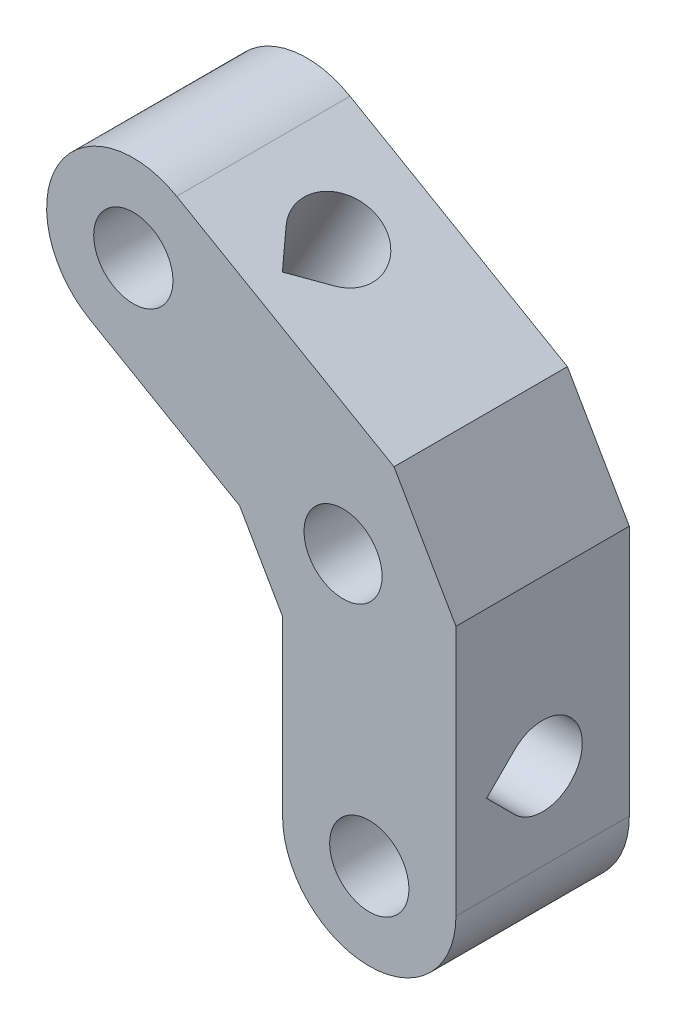
ISO-10303-21;
HEADER;
FILE_DESCRIPTION(('STEP AP214'),'2;1');
FILE_NAME('part.step','',(''),(''),'','','');
FILE_SCHEMA(('AUTOMOTIVE_DESIGN { 1 0 10303 214 1 1 1 1 }'));
ENDSEC;
DATA;
#1=APPLICATION_CONTEXT('core data for automotive mechanical design processes');
#2=APPLICATION_PROTOCOL_DEFINITION('international standard','automotive_design',2000,#1);
#3=PRODUCT_CONTEXT('',#1,'mechanical');
#4=PRODUCT('Part','Part','',(#3));
#5=PRODUCT_RELATED_PRODUCT_CATEGORY('part','',(#4));
#6=PRODUCT_DEFINITION_FORMATION('','',#4);
#7=PRODUCT_DEFINITION_CONTEXT('part definition',#1,'design');
#8=PRODUCT_DEFINITION('design','',#6,#7);
#9=PRODUCT_DEFINITION_SHAPE('','',#8);
#10=(LENGTH_UNIT() NAMED_UNIT(*) SI_UNIT(.MILLI.,.METRE.));
#11=(NAMED_UNIT(*) PLANE_ANGLE_UNIT() SI_UNIT($,.RADIAN.));
#12=(NAMED_UNIT(*) SI_UNIT($,.STERADIAN.) SOLID_ANGLE_UNIT());
#13=UNCERTAINTY_MEASURE_WITH_UNIT(LENGTH_MEASURE(1.E-05),#10,'distance_accuracy_value','');
#14=(GEOMETRIC_REPRESENTATION_CONTEXT(3) GLOBAL_UNCERTAINTY_ASSIGNED_CONTEXT((#13)) GLOBAL_UNIT_ASSIGNED_CONTEXT((#10,
#11,#12)) REPRESENTATION_CONTEXT('',''));
#15=CARTESIAN_POINT('',(0.,0.,0.));
#16=DIRECTION('',(0.,0.,1.));
#17=DIRECTION('',(1.,0.,0.));
#18=AXIS2_PLACEMENT_3D('',#15,#16,#17);
#19=CARTESIAN_POINT('',(1.76659838198365E-13,2.35810055605255E-13,0.));
#20=DIRECTION('',(0.,0.,1.));
#21=DIRECTION('',(1.,0.,0.));
#22=AXIS2_PLACEMENT_3D('',#19,#20,#21);
#23=CYLINDRICAL_SURFACE('',#22,7.);
#24=CARTESIAN_POINT('',(1.76659838198365E-13,2.35810055605255E-13,14.));
#25=DIRECTION('',(0.,0.,1.));
#26=DIRECTION('',(1.,0.,0.));
#27=AXIS2_PLACEMENT_3D('',#24,#25,#26);
#28=CIRCLE('',#27,7.);
#29=CARTESIAN_POINT('',(-6.99999999999982,2.35810055605255E-13,14.));
#30=VERTEX_POINT('',#29);
#31=CARTESIAN_POINT('',(7.00000000000018,2.35810055605255E-13,14.));
#32=VERTEX_POINT('',#31);
#33=EDGE_CURVE('E191',#30,#32,#28,.T.);
#34=ORIENTED_EDGE('',*,*,#33,.F.);
#35=DIRECTION('',(0.,0.,1.));
#36=VECTOR('',#35,1.);
#37=CARTESIAN_POINT('',(-6.99999999999982,2.35810055605255E-13,0.));
#38=LINE('',#37,#36);
#39=CARTESIAN_POINT('',(-6.99999999999982,2.35810055605255E-13,0.));
#40=VERTEX_POINT('',#39);
#41=EDGE_CURVE('E240',#40,#30,#38,.T.);
#42=ORIENTED_EDGE('',*,*,#41,.F.);
#43=CARTESIAN_POINT('',(1.76659838198365E-13,2.35810055605255E-13,0.));
#44=DIRECTION('',(0.,0.,1.));
#45=DIRECTION('',(1.,0.,0.));
#46=AXIS2_PLACEMENT_3D('',#43,#44,#45);
#47=CIRCLE('',#46,7.);
#48=CARTESIAN_POINT('',(7.00000000000018,2.35810055605255E-13,0.));
#49=VERTEX_POINT('',#48);
#50=EDGE_CURVE('E192',#40,#49,#47,.T.);
#51=ORIENTED_EDGE('',*,*,#50,.T.);
#52=DIRECTION('',(0.,0.,1.));
#53=VECTOR('',#52,1.);
#54=CARTESIAN_POINT('',(7.00000000000018,2.35810055605255E-13,0.));
#55=LINE('',#54,#53);
#56=EDGE_CURVE('E217',#49,#32,#55,.T.);
#57=ORIENTED_EDGE('',*,*,#56,.T.);
#58=EDGE_LOOP('',(#34,#42,#51,#57));
#59=FACE_BOUND('',#58,.T.);
#60=ADVANCED_FACE('F34',(#59),#23,.T.);
#61=CARTESIAN_POINT('',(-6.9999999999999,13.9585481156721,0.));
#62=DIRECTION('',(-1.,0.,0.));
#63=DIRECTION('',(0.,-1.,0.));
#64=AXIS2_PLACEMENT_3D('',#61,#62,#63);
#65=PLANE('',#64);
#66=CARTESIAN_POINT('',(-6.99999999999982,6.99999999999998,7.));
#67=DIRECTION('',(-1.,0.,0.));
#68=DIRECTION('',(0.,-1.,0.));
#69=AXIS2_PLACEMENT_3D('',#66,#67,#68);
#70=CIRCLE('',#69,3.20000000000001);
#71=CARTESIAN_POINT('',(-6.99999999999982,9.2627416997969,9.26274169979695));
#72=VERTEX_POINT('',#71);
#73=CARTESIAN_POINT('',(-6.99999999999985,4.73725830020299,9.26274169979696));
#74=VERTEX_POINT('',#73);
#75=EDGE_CURVE('E48',#72,#74,#70,.T.);
#76=ORIENTED_EDGE('',*,*,#75,.F.);
#77=DIRECTION('',(0.,0.707106781186546,-0.707106781186549));
#78=VECTOR('',#77,1.);
#79=CARTESIAN_POINT('',(-6.99999999999982,6.99999999999995,11.5254833995939));
#80=LINE('',#79,#78);
#81=CARTESIAN_POINT('',(-6.99999999999982,6.99999999999995,11.5254833995939));
#82=VERTEX_POINT('',#81);
#83=EDGE_CURVE('E148',#82,#72,#80,.T.);
#84=ORIENTED_EDGE('',*,*,#83,.F.);
#85=DIRECTION('',(0.,0.707106781186549,0.707106781186546));
#86=VECTOR('',#85,1.);
#87=CARTESIAN_POINT('',(-6.99999999999982,4.73725830020299,9.26274169979696));
#88=LINE('',#87,#86);
#89=EDGE_CURVE('E151',#74,#82,#88,.T.);
#90=ORIENTED_EDGE('',*,*,#89,.F.);
#91=EDGE_LOOP('',(#76,#84,#90));
#92=FACE_BOUND('',#91,.T.);
#93=DIRECTION('',(0.,-1.,0.));
#94=VECTOR('',#93,1.);
#95=CARTESIAN_POINT('',(-6.9999999999999,13.9585481156721,14.));
#96=LINE('',#95,#94);
#97=CARTESIAN_POINT('',(-6.9999999999999,13.9585481156721,14.));
#98=VERTEX_POINT('',#97);
#99=EDGE_CURVE('E196',#98,#30,#96,.T.);
#100=ORIENTED_EDGE('',*,*,#99,.F.);
#101=DIRECTION('',(0.,0.,1.));
#102=VECTOR('',#101,1.);
#103=CARTESIAN_POINT('',(-6.9999999999999,13.9585481156721,0.));
#104=LINE('',#103,#102);
#105=CARTESIAN_POINT('',(-6.9999999999999,13.9585481156721,0.));
#106=VERTEX_POINT('',#105);
#107=EDGE_CURVE('E243',#106,#98,#104,.T.);
#108=ORIENTED_EDGE('',*,*,#107,.F.);
#109=DIRECTION('',(0.,-1.,0.));
#110=VECTOR('',#109,1.);
#111=CARTESIAN_POINT('',(-6.9999999999999,13.9585481156721,0.));
#112=LINE('',#111,#110);
#113=EDGE_CURVE('E214',#106,#40,#112,.T.);
#114=ORIENTED_EDGE('',*,*,#113,.T.);
#115=ORIENTED_EDGE('',*,*,#41,.T.);
#116=EDGE_LOOP('',(#100,#108,#114,#115));
#117=FACE_BOUND('',#116,.T.);
#118=ADVANCED_FACE('F306',(#92,#117),#65,.T.);
#119=CARTESIAN_POINT('',(-10.4641016151382,19.9585481156731,0.));
#120=DIRECTION('',(-0.866025403784439,-0.5,0.));
#121=DIRECTION('',(0.5,-0.866025403784439,0.));
#122=AXIS2_PLACEMENT_3D('',#119,#120,#121);
#123=PLANE('',#122);
#124=DIRECTION('',(0.5,-0.866025403784439,0.));
#125=VECTOR('',#124,1.);
#126=CARTESIAN_POINT('',(-10.4641016151382,19.9585481156731,14.));
#127=LINE('',#126,#125);
#128=CARTESIAN_POINT('',(-10.4641016151382,19.9585481156731,14.));
#129=VERTEX_POINT('',#128);
#130=EDGE_CURVE('E235',#129,#98,#127,.T.);
#131=ORIENTED_EDGE('',*,*,#130,.F.);
#132=DIRECTION('',(0.,0.,1.));
#133=VECTOR('',#132,1.);
#134=CARTESIAN_POINT('',(-10.4641016151382,19.9585481156731,0.));
#135=LINE('',#134,#133);
#136=CARTESIAN_POINT('',(-10.4641016151382,19.9585481156731,0.));
#137=VERTEX_POINT('',#136);
#138=EDGE_CURVE('E245',#137,#129,#135,.T.);
#139=ORIENTED_EDGE('',*,*,#138,.F.);
#140=DIRECTION('',(0.5,-0.866025403784439,0.));
#141=VECTOR('',#140,1.);
#142=CARTESIAN_POINT('',(-10.4641016151382,19.9585481156731,0.));
#143=LINE('',#142,#141);
#144=EDGE_CURVE('E211',#137,#106,#143,.T.);
#145=ORIENTED_EDGE('',*,*,#144,.T.);
#146=ORIENTED_EDGE('',*,*,#107,.T.);
#147=EDGE_LOOP('',(#131,#139,#145,#146));
#148=FACE_BOUND('',#147,.T.);
#149=ADVANCED_FACE('F279',(#148),#123,.T.);
#150=CARTESIAN_POINT('',(-22.5525588832574,26.9378221735091,0.));
#151=DIRECTION('',(-0.500000000000008,-0.866025403784434,0.));
#152=DIRECTION('',(0.866025403784434,-0.500000000000008,0.));
#153=AXIS2_PLACEMENT_3D('',#150,#151,#152);
#154=PLANE('',#153);
#155=DIRECTION('',(-0.612372435695794,0.353553390593271,0.707106781186549));
#156=VECTOR('',#155,1.);
#157=CARTESIAN_POINT('',(-14.5307009376536,22.3064003292134,9.26274169979695));
#158=LINE('',#157,#156);
#159=CARTESIAN_POINT('',(-14.5307009376536,22.3064003292134,9.26274169979695));
#160=VERTEX_POINT('',#159);
#161=CARTESIAN_POINT('',(-16.49029273188,23.4377711791122,11.5254833995939));
#162=VERTEX_POINT('',#161);
#163=EDGE_CURVE('E163',#160,#162,#158,.T.);
#164=ORIENTED_EDGE('',*,*,#163,.F.);
#165=CARTESIAN_POINT('',(-16.4902927318801,23.4377711791119,7.));
#166=DIRECTION('',(-0.499999999999998,-0.86602540378444,0.));
#167=DIRECTION('',(0.86602540378444,-0.499999999999998,0.));
#168=AXIS2_PLACEMENT_3D('',#165,#166,#167);
#169=CIRCLE('',#168,3.2);
#170=CARTESIAN_POINT('',(-18.4498845261067,24.5691420290104,9.26274169979696));
#171=VERTEX_POINT('',#170);
#172=EDGE_CURVE('E169',#171,#160,#169,.T.);
#173=ORIENTED_EDGE('',*,*,#172,.F.);
#174=DIRECTION('',(-0.612372435695796,0.353553390593272,-0.707106781186547));
#175=VECTOR('',#174,1.);
#176=CARTESIAN_POINT('',(-16.4902927318801,23.4377711791119,11.5254833995939));
#177=LINE('',#176,#175);
#178=EDGE_CURVE('E166',#162,#171,#177,.T.);
#179=ORIENTED_EDGE('',*,*,#178,.F.);
#180=EDGE_LOOP('',(#164,#173,#179));
#181=FACE_BOUND('',#180,.T.);
#182=DIRECTION('',(0.866025403784434,-0.500000000000008,0.));
#183=VECTOR('',#182,1.);
#184=CARTESIAN_POINT('',(-22.5525588832574,26.9378221735091,14.));
#185=LINE('',#184,#183);
#186=CARTESIAN_POINT('',(-22.5525588832574,26.9378221735091,14.));
#187=VERTEX_POINT('',#186);
#188=EDGE_CURVE('E232',#187,#129,#185,.T.);
#189=ORIENTED_EDGE('',*,*,#188,.F.);
#190=DIRECTION('',(0.,0.,1.));
#191=VECTOR('',#190,1.);
#192=CARTESIAN_POINT('',(-22.5525588832574,26.9378221735091,0.));
#193=LINE('',#192,#191);
#194=CARTESIAN_POINT('',(-22.5525588832574,26.9378221735091,0.));
#195=VERTEX_POINT('',#194);
#196=EDGE_CURVE('E247',#195,#187,#193,.T.);
#197=ORIENTED_EDGE('',*,*,#196,.F.);
#198=DIRECTION('',(0.866025403784434,-0.500000000000008,0.));
#199=VECTOR('',#198,1.);
#200=CARTESIAN_POINT('',(-22.5525588832574,26.9378221735091,0.));
#201=LINE('',#200,#199);
#202=EDGE_CURVE('E208',#195,#137,#201,.T.);
#203=ORIENTED_EDGE('',*,*,#202,.T.);
#204=ORIENTED_EDGE('',*,*,#138,.T.);
#205=EDGE_LOOP('',(#189,#197,#203,#204));
#206=FACE_BOUND('',#205,.T.);
#207=ADVANCED_FACE('F275',(#181,#206),#154,.T.);
#208=CARTESIAN_POINT('',(-19.0525588832574,33.0000000000002,0.));
#209=DIRECTION('',(0.,0.,1.));
#210=DIRECTION('',(1.,0.,0.));
#211=AXIS2_PLACEMENT_3D('',#208,#209,#210);
#212=CYLINDRICAL_SURFACE('',#211,7.);
#213=CARTESIAN_POINT('',(-19.0525588832574,33.0000000000002,14.));
#214=DIRECTION('',(0.,0.,1.));
#215=DIRECTION('',(1.,0.,0.));
#216=AXIS2_PLACEMENT_3D('',#213,#214,#215);
#217=CIRCLE('',#216,7.);
#218=CARTESIAN_POINT('',(-15.5525588832575,39.0621778264913,14.));
#219=VERTEX_POINT('',#218);
#220=EDGE_CURVE('E229',#219,#187,#217,.T.);
#221=ORIENTED_EDGE('',*,*,#220,.F.);
#222=DIRECTION('',(0.,0.,1.));
#223=VECTOR('',#222,1.);
#224=CARTESIAN_POINT('',(-15.5525588832575,39.0621778264913,0.));
#225=LINE('',#224,#223);
#226=CARTESIAN_POINT('',(-15.5525588832575,39.0621778264913,0.));
#227=VERTEX_POINT('',#226);
#228=EDGE_CURVE('E249',#227,#219,#225,.T.);
#229=ORIENTED_EDGE('',*,*,#228,.F.);
#230=CARTESIAN_POINT('',(-19.0525588832574,33.0000000000002,0.));
#231=DIRECTION('',(0.,0.,1.));
#232=DIRECTION('',(1.,0.,0.));
#233=AXIS2_PLACEMENT_3D('',#230,#231,#232);
#234=CIRCLE('',#233,7.);
#235=EDGE_CURVE('E205',#227,#195,#234,.T.);
#236=ORIENTED_EDGE('',*,*,#235,.T.);
#237=ORIENTED_EDGE('',*,*,#196,.T.);
#238=EDGE_LOOP('',(#221,#229,#236,#237));
#239=FACE_BOUND('',#238,.T.);
#240=ADVANCED_FACE('F278',(#239),#212,.T.);
#241=CARTESIAN_POINT('',(2.00000000000025,28.9282032302758,0.));
#242=DIRECTION('',(0.499999999999997,0.86602540378444,0.));
#243=DIRECTION('',(-0.866025403784441,0.499999999999997,0.));
#244=AXIS2_PLACEMENT_3D('',#241,#242,#243);
#245=PLANE('',#244);
#246=DIRECTION('',(0.612372435695794,-0.353553390593271,-0.707106781186549));
#247=VECTOR('',#246,1.);
#248=CARTESIAN_POINT('',(1.2455343415322,29.3637941812867,-0.871181902021698));
#249=LINE('',#248,#247);
#250=CARTESIAN_POINT('',(-9.49029273187996,35.5621268320944,11.5254833995939));
#251=VERTEX_POINT('',#250);
#252=CARTESIAN_POINT('',(-7.53070093765341,34.4307559821959,9.26274169979695));
#253=VERTEX_POINT('',#252);
#254=EDGE_CURVE('E11',#251,#253,#249,.T.);
#255=ORIENTED_EDGE('',*,*,#254,.F.);
#256=DIRECTION('',(0.612372435695797,-0.353553390593272,0.707106781186547));
#257=VECTOR('',#256,1.);
#258=CARTESIAN_POINT('',(-8.73582707341194,35.1265358810836,12.3966653016156));
#259=LINE('',#258,#257);
#260=CARTESIAN_POINT('',(-11.4498845261065,36.6934976819929,9.26274169979696));
#261=VERTEX_POINT('',#260);
#262=EDGE_CURVE('E242',#261,#251,#259,.T.);
#263=ORIENTED_EDGE('',*,*,#262,.F.);
#264=CARTESIAN_POINT('',(-9.49029273187996,35.5621268320944,7.));
#265=DIRECTION('',(0.499999999999997,0.86602540378444,0.));
#266=DIRECTION('',(-0.866025403784441,0.499999999999997,0.));
#267=AXIS2_PLACEMENT_3D('',#264,#265,#266);
#268=CIRCLE('',#267,3.2);
#269=EDGE_CURVE('E41',#253,#261,#268,.T.);
#270=ORIENTED_EDGE('',*,*,#269,.F.);
#271=EDGE_LOOP('',(#255,#263,#270));
#272=FACE_BOUND('',#271,.T.);
#273=DIRECTION('',(-0.86602540378444,0.499999999999997,0.));
#274=VECTOR('',#273,1.);
#275=CARTESIAN_POINT('',(2.00000000000025,28.9282032302758,14.));
#276=LINE('',#275,#274);
#277=CARTESIAN_POINT('',(2.00000000000025,28.9282032302758,14.));
#278=VERTEX_POINT('',#277);
#279=EDGE_CURVE('E226',#278,#219,#276,.T.);
#280=ORIENTED_EDGE('',*,*,#279,.F.);
#281=DIRECTION('',(0.,0.,1.));
#282=VECTOR('',#281,1.);
#283=CARTESIAN_POINT('',(2.00000000000025,28.9282032302758,0.));
#284=LINE('',#283,#282);
#285=CARTESIAN_POINT('',(2.00000000000025,28.9282032302758,0.));
#286=VERTEX_POINT('',#285);
#287=EDGE_CURVE('E251',#286,#278,#284,.T.);
#288=ORIENTED_EDGE('',*,*,#287,.F.);
#289=DIRECTION('',(-0.86602540378444,0.499999999999997,0.));
#290=VECTOR('',#289,1.);
#291=CARTESIAN_POINT('',(2.00000000000025,28.9282032302758,0.));
#292=LINE('',#291,#290);
#293=EDGE_CURVE('E202',#286,#227,#292,.T.);
#294=ORIENTED_EDGE('',*,*,#293,.T.);
#295=ORIENTED_EDGE('',*,*,#228,.T.);
#296=EDGE_LOOP('',(#280,#288,#294,#295));
#297=FACE_BOUND('',#296,.T.);
#298=ADVANCED_FACE('F264',(#272,#297),#245,.T.);
#299=CARTESIAN_POINT('',(7.00000000000016,20.2679491924314,0.));
#300=DIRECTION('',(0.866025403784444,0.499999999999991,0.));
#301=DIRECTION('',(-0.499999999999991,0.866025403784444,0.));
#302=AXIS2_PLACEMENT_3D('',#299,#300,#301);
#303=PLANE('',#302);
#304=DIRECTION('',(-0.499999999999991,0.866025403784444,0.));
#305=VECTOR('',#304,1.);
#306=CARTESIAN_POINT('',(7.00000000000016,20.2679491924314,14.));
#307=LINE('',#306,#305);
#308=CARTESIAN_POINT('',(7.00000000000016,20.2679491924314,14.));
#309=VERTEX_POINT('',#308);
#310=EDGE_CURVE('E223',#309,#278,#307,.T.);
#311=ORIENTED_EDGE('',*,*,#310,.F.);
#312=DIRECTION('',(0.,0.,1.));
#313=VECTOR('',#312,1.);
#314=CARTESIAN_POINT('',(7.00000000000016,20.2679491924314,0.));
#315=LINE('',#314,#313);
#316=CARTESIAN_POINT('',(7.00000000000016,20.2679491924314,0.));
#317=VERTEX_POINT('',#316);
#318=EDGE_CURVE('E253',#317,#309,#315,.T.);
#319=ORIENTED_EDGE('',*,*,#318,.F.);
#320=DIRECTION('',(-0.499999999999991,0.866025403784444,0.));
#321=VECTOR('',#320,1.);
#322=CARTESIAN_POINT('',(7.00000000000016,20.2679491924314,0.));
#323=LINE('',#322,#321);
#324=EDGE_CURVE('E199',#317,#286,#323,.T.);
#325=ORIENTED_EDGE('',*,*,#324,.T.);
#326=ORIENTED_EDGE('',*,*,#287,.T.);
#327=EDGE_LOOP('',(#311,#319,#325,#326));
#328=FACE_BOUND('',#327,.T.);
#329=ADVANCED_FACE('F298',(#328),#303,.T.);
#330=CARTESIAN_POINT('',(7.00000000000018,2.35810055605255E-13,0.));
#331=DIRECTION('',(1.,0.,0.));
#332=DIRECTION('',(0.,1.,0.));
#333=AXIS2_PLACEMENT_3D('',#330,#331,#332);
#334=PLANE('',#333);
#335=CARTESIAN_POINT('',(7.00000000000018,6.99999999999998,7.));
#336=DIRECTION('',(-1.,0.,0.));
#337=DIRECTION('',(0.,-1.,0.));
#338=AXIS2_PLACEMENT_3D('',#335,#336,#337);
#339=CIRCLE('',#338,3.20000000000001);
#340=CARTESIAN_POINT('',(7.00000000000018,9.2627416997969,9.26274169979695));
#341=VERTEX_POINT('',#340);
#342=CARTESIAN_POINT('',(7.00000000000018,4.73725830020299,9.26274169979696));
#343=VERTEX_POINT('',#342);
#344=EDGE_CURVE('E135',#341,#343,#339,.T.);
#345=ORIENTED_EDGE('',*,*,#344,.T.);
#346=DIRECTION('',(0.,0.707106781186549,0.707106781186546));
#347=VECTOR('',#346,1.);
#348=CARTESIAN_POINT('',(7.00000000000018,4.73725830020299,9.26274169979696));
#349=LINE('',#348,#347);
#350=CARTESIAN_POINT('',(7.00000000000017,6.99999999999995,11.5254833995939));
#351=VERTEX_POINT('',#350);
#352=EDGE_CURVE('E142',#343,#351,#349,.T.);
#353=ORIENTED_EDGE('',*,*,#352,.T.);
#354=DIRECTION('',(0.,0.707106781186546,-0.707106781186549));
#355=VECTOR('',#354,1.);
#356=CARTESIAN_POINT('',(7.00000000000018,6.99999999999995,11.5254833995939));
#357=LINE('',#356,#355);
#358=EDGE_CURVE('E56',#351,#341,#357,.T.);
#359=ORIENTED_EDGE('',*,*,#358,.T.);
#360=EDGE_LOOP('',(#345,#353,#359));
#361=FACE_BOUND('',#360,.T.);
#362=DIRECTION('',(0.,1.,0.));
#363=VECTOR('',#362,1.);
#364=CARTESIAN_POINT('',(7.00000000000018,2.35810055605255E-13,14.));
#365=LINE('',#364,#363);
#366=EDGE_CURVE('E220',#32,#309,#365,.T.);
#367=ORIENTED_EDGE('',*,*,#366,.F.);
#368=ORIENTED_EDGE('',*,*,#56,.F.);
#369=DIRECTION('',(0.,1.,0.));
#370=VECTOR('',#369,1.);
#371=CARTESIAN_POINT('',(7.00000000000018,2.35810055605255E-13,0.));
#372=LINE('',#371,#370);
#373=EDGE_CURVE('E195',#49,#317,#372,.T.);
#374=ORIENTED_EDGE('',*,*,#373,.T.);
#375=ORIENTED_EDGE('',*,*,#318,.T.);
#376=EDGE_LOOP('',(#367,#368,#374,#375));
#377=FACE_BOUND('',#376,.T.);
#378=ADVANCED_FACE('F146',(#361,#377),#334,.T.);
#379=CARTESIAN_POINT('',(1.76659838198365E-13,2.35810055605255E-13,0.));
#380=DIRECTION('',(0.,0.,1.));
#381=DIRECTION('',(1.,0.,0.));
#382=AXIS2_PLACEMENT_3D('',#379,#380,#381);
#383=PLANE('',#382);
#384=CARTESIAN_POINT('',(-2.11602540378443,20.7783121635131,0.));
#385=DIRECTION('',(0.,0.,1.));
#386=DIRECTION('',(1.,0.,0.));
#387=AXIS2_PLACEMENT_3D('',#384,#385,#386);
#388=CIRCLE('',#387,3.15);
#389=CARTESIAN_POINT('',(1.03397459621557,20.7783121635131,0.));
#390=VERTEX_POINT('',#389);
#391=EDGE_CURVE('E159',#390,#390,#388,.T.);
#392=ORIENTED_EDGE('',*,*,#391,.T.);
#393=EDGE_LOOP('',(#392));
#394=FACE_BOUND('',#393,.T.);
#395=CARTESIAN_POINT('',(-19.0525,32.999898011206,0.));
#396=DIRECTION('',(0.,0.,-1.));
#397=DIRECTION('',(-1.,0.,0.));
#398=AXIS2_PLACEMENT_3D('',#395,#396,#397);
#399=CIRCLE('',#398,3.20000000000001);
#400=CARTESIAN_POINT('',(-22.2525,32.999898011206,0.));
#401=VERTEX_POINT('',#400);
#402=EDGE_CURVE('E175',#401,#401,#399,.T.);
#403=ORIENTED_EDGE('',*,*,#402,.F.);
#404=EDGE_LOOP('',(#403));
#405=FACE_BOUND('',#404,.T.);
#406=CARTESIAN_POINT('',(0.,0.,0.));
#407=DIRECTION('',(0.,0.,-1.));
#408=DIRECTION('',(-1.,0.,0.));
#409=AXIS2_PLACEMENT_3D('',#406,#407,#408);
#410=CIRCLE('',#409,3.20000000000001);
#411=CARTESIAN_POINT('',(-3.20000000000001,0.,0.));
#412=VERTEX_POINT('',#411);
#413=EDGE_CURVE('E185',#412,#412,#410,.T.);
#414=ORIENTED_EDGE('',*,*,#413,.F.);
#415=EDGE_LOOP('',(#414));
#416=FACE_BOUND('',#415,.T.);
#417=ORIENTED_EDGE('',*,*,#50,.F.);
#418=ORIENTED_EDGE('',*,*,#113,.F.);
#419=ORIENTED_EDGE('',*,*,#144,.F.);
#420=ORIENTED_EDGE('',*,*,#202,.F.);
#421=ORIENTED_EDGE('',*,*,#235,.F.);
#422=ORIENTED_EDGE('',*,*,#293,.F.);
#423=ORIENTED_EDGE('',*,*,#324,.F.);
#424=ORIENTED_EDGE('',*,*,#373,.F.);
#425=EDGE_LOOP('',(#417,#418,#419,#420,#421,#422,#423,#424));
#426=FACE_BOUND('',#425,.T.);
#427=ADVANCED_FACE('F293',(#394,#405,#416,#426),#383,.F.);
#428=CARTESIAN_POINT('',(1.76659838198365E-13,2.35810055605255E-13,14.));
#429=DIRECTION('',(0.,0.,1.));
#430=DIRECTION('',(1.,0.,0.));
#431=AXIS2_PLACEMENT_3D('',#428,#429,#430);
#432=PLANE('',#431);
#433=CARTESIAN_POINT('',(-2.11602540378443,20.7783121635131,14.));
#434=DIRECTION('',(0.,0.,1.));
#435=DIRECTION('',(1.,0.,0.));
#436=AXIS2_PLACEMENT_3D('',#433,#434,#435);
#437=CIRCLE('',#436,3.15);
#438=CARTESIAN_POINT('',(1.03397459621557,20.7783121635131,14.));
#439=VERTEX_POINT('',#438);
#440=EDGE_CURVE('E154',#439,#439,#437,.T.);
#441=ORIENTED_EDGE('',*,*,#440,.F.);
#442=EDGE_LOOP('',(#441));
#443=FACE_BOUND('',#442,.T.);
#444=CARTESIAN_POINT('',(-19.0525,32.999898011206,14.));
#445=DIRECTION('',(0.,0.,-1.));
#446=DIRECTION('',(-1.,0.,0.));
#447=AXIS2_PLACEMENT_3D('',#444,#445,#446);
#448=CIRCLE('',#447,3.20000000000001);
#449=CARTESIAN_POINT('',(-22.2525,32.999898011206,14.));
#450=VERTEX_POINT('',#449);
#451=EDGE_CURVE('E182',#450,#450,#448,.T.);
#452=ORIENTED_EDGE('',*,*,#451,.T.);
#453=EDGE_LOOP('',(#452));
#454=FACE_BOUND('',#453,.T.);
#455=CARTESIAN_POINT('',(0.,0.,14.));
#456=DIRECTION('',(0.,0.,-1.));
#457=DIRECTION('',(-1.,0.,0.));
#458=AXIS2_PLACEMENT_3D('',#455,#456,#457);
#459=CIRCLE('',#458,3.20000000000001);
#460=CARTESIAN_POINT('',(-3.20000000000001,0.,14.));
#461=VERTEX_POINT('',#460);
#462=EDGE_CURVE('E188',#461,#461,#459,.T.);
#463=ORIENTED_EDGE('',*,*,#462,.T.);
#464=EDGE_LOOP('',(#463));
#465=FACE_BOUND('',#464,.T.);
#466=ORIENTED_EDGE('',*,*,#33,.T.);
#467=ORIENTED_EDGE('',*,*,#366,.T.);
#468=ORIENTED_EDGE('',*,*,#310,.T.);
#469=ORIENTED_EDGE('',*,*,#279,.T.);
#470=ORIENTED_EDGE('',*,*,#220,.T.);
#471=ORIENTED_EDGE('',*,*,#188,.T.);
#472=ORIENTED_EDGE('',*,*,#130,.T.);
#473=ORIENTED_EDGE('',*,*,#99,.T.);
#474=EDGE_LOOP('',(#466,#467,#468,#469,#470,#471,#472,#473));
#475=FACE_BOUND('',#474,.T.);
#476=ADVANCED_FACE('F286',(#443,#454,#465,#475),#432,.T.);
#477=CARTESIAN_POINT('',(0.,0.,0.));
#478=DIRECTION('',(0.,0.,-1.));
#479=DIRECTION('',(-1.,0.,0.));
#480=AXIS2_PLACEMENT_3D('',#477,#478,#479);
#481=CYLINDRICAL_SURFACE('',#480,3.20000000000001);
#482=ORIENTED_EDGE('',*,*,#462,.F.);
#483=EDGE_LOOP('',(#482));
#484=FACE_BOUND('',#483,.T.);
#485=ORIENTED_EDGE('',*,*,#413,.T.);
#486=EDGE_LOOP('',(#485));
#487=FACE_BOUND('',#486,.T.);
#488=ADVANCED_FACE('F383',(#484,#487),#481,.F.);
#489=CARTESIAN_POINT('',(-19.0525,32.999898011206,0.));
#490=DIRECTION('',(0.,0.,-1.));
#491=DIRECTION('',(-1.,0.,0.));
#492=AXIS2_PLACEMENT_3D('',#489,#490,#491);
#493=CYLINDRICAL_SURFACE('',#492,3.20000000000001);
#494=ORIENTED_EDGE('',*,*,#451,.F.);
#495=EDGE_LOOP('',(#494));
#496=FACE_BOUND('',#495,.T.);
#497=ORIENTED_EDGE('',*,*,#402,.T.);
#498=EDGE_LOOP('',(#497));
#499=FACE_BOUND('',#498,.T.);
#500=ADVANCED_FACE('F405',(#496,#499),#493,.F.);
#501=CARTESIAN_POINT('',(-1.48647230359353,44.8996670689503,9.26274169979695));
#502=DIRECTION('',(0.612372435695797,-0.353553390593273,0.707106781186546));
#503=DIRECTION('',(0.755928946018453,0.,-0.65465367070798));
#504=AXIS2_PLACEMENT_3D('',#501,#502,#503);
#505=PLANE('',#504);
#506=ORIENTED_EDGE('',*,*,#254,.T.);
#507=DIRECTION('',(-0.499999999999998,-0.86602540378444,0.));
#508=VECTOR('',#507,1.);
#509=CARTESIAN_POINT('',(-1.48647230359353,44.8996670689503,9.26274169979695));
#510=LINE('',#509,#508);
#511=EDGE_CURVE('E173',#253,#160,#510,.T.);
#512=ORIENTED_EDGE('',*,*,#511,.T.);
#513=ORIENTED_EDGE('',*,*,#163,.T.);
#514=DIRECTION('',(-0.499999999999998,-0.86602540378444,0.));
#515=VECTOR('',#514,1.);
#516=CARTESIAN_POINT('',(-3.44606409782007,46.0310379188488,11.5254833995939));
#517=LINE('',#516,#515);
#518=EDGE_CURVE('E172',#251,#162,#517,.T.);
#519=ORIENTED_EDGE('',*,*,#518,.F.);
#520=EDGE_LOOP('',(#506,#512,#513,#519));
#521=FACE_BOUND('',#520,.T.);
#522=ADVANCED_FACE('F271',(#521),#505,.F.);
#523=CARTESIAN_POINT('',(-3.44606409782007,46.0310379188488,7.));
#524=DIRECTION('',(-0.499999999999998,-0.86602540378444,0.));
#525=DIRECTION('',(0.86602540378444,-0.499999999999998,0.));
#526=AXIS2_PLACEMENT_3D('',#523,#524,#525);
#527=CYLINDRICAL_SURFACE('',#526,3.2);
#528=ORIENTED_EDGE('',*,*,#269,.T.);
#529=DIRECTION('',(-0.499999999999998,-0.86602540378444,0.));
#530=VECTOR('',#529,1.);
#531=CARTESIAN_POINT('',(-5.40565589204662,47.1624087687473,9.26274169979696));
#532=LINE('',#531,#530);
#533=EDGE_CURVE('E176',#261,#171,#532,.T.);
#534=ORIENTED_EDGE('',*,*,#533,.T.);
#535=ORIENTED_EDGE('',*,*,#172,.T.);
#536=ORIENTED_EDGE('',*,*,#511,.F.);
#537=EDGE_LOOP('',(#528,#534,#535,#536));
#538=FACE_BOUND('',#537,.T.);
#539=ADVANCED_FACE('F261',(#538),#527,.F.);
#540=CARTESIAN_POINT('',(-3.44606409782007,46.0310379188488,11.5254833995939));
#541=DIRECTION('',(-0.612372435695795,0.353553390593272,0.707106781186548));
#542=DIRECTION('',(0.755928946018455,0.,0.654653670707977));
#543=AXIS2_PLACEMENT_3D('',#540,#541,#542);
#544=PLANE('',#543);
#545=ORIENTED_EDGE('',*,*,#262,.T.);
#546=ORIENTED_EDGE('',*,*,#518,.T.);
#547=ORIENTED_EDGE('',*,*,#178,.T.);
#548=ORIENTED_EDGE('',*,*,#533,.F.);
#549=EDGE_LOOP('',(#545,#546,#547,#548));
#550=FACE_BOUND('',#549,.T.);
#551=ADVANCED_FACE('F268',(#550),#544,.F.);
#552=CARTESIAN_POINT('',(7.00000000000018,6.99999999999998,7.));
#553=DIRECTION('',(-1.,0.,0.));
#554=DIRECTION('',(0.,-1.,0.));
#555=AXIS2_PLACEMENT_3D('',#552,#553,#554);
#556=CYLINDRICAL_SURFACE('',#555,3.20000000000001);
#557=ORIENTED_EDGE('',*,*,#75,.T.);
#558=DIRECTION('',(-1.,0.,0.));
#559=VECTOR('',#558,1.);
#560=CARTESIAN_POINT('',(7.00000000000018,4.73725830020299,9.26274169979696));
#561=LINE('',#560,#559);
#562=EDGE_CURVE('E131',#343,#74,#561,.T.);
#563=ORIENTED_EDGE('',*,*,#562,.F.);
#564=ORIENTED_EDGE('',*,*,#344,.F.);
#565=DIRECTION('',(-1.,0.,0.));
#566=VECTOR('',#565,1.);
#567=CARTESIAN_POINT('',(7.00000000000018,9.2627416997969,9.26274169979695));
#568=LINE('',#567,#566);
#569=EDGE_CURVE('E161',#341,#72,#568,.T.);
#570=ORIENTED_EDGE('',*,*,#569,.T.);
#571=EDGE_LOOP('',(#557,#563,#564,#570));
#572=FACE_BOUND('',#571,.T.);
#573=ADVANCED_FACE('F133',(#572),#556,.F.);
#574=CARTESIAN_POINT('',(7.00000000000018,6.99999999999995,11.5254833995939));
#575=DIRECTION('',(0.,0.707106781186549,0.707106781186546));
#576=DIRECTION('',(0.,-0.707106781186546,0.707106781186549));
#577=AXIS2_PLACEMENT_3D('',#574,#575,#576);
#578=PLANE('',#577);
#579=ORIENTED_EDGE('',*,*,#83,.T.);
#580=ORIENTED_EDGE('',*,*,#569,.F.);
#581=ORIENTED_EDGE('',*,*,#358,.F.);
#582=DIRECTION('',(-1.,0.,0.));
#583=VECTOR('',#582,1.);
#584=CARTESIAN_POINT('',(7.00000000000018,6.99999999999995,11.5254833995939));
#585=LINE('',#584,#583);
#586=EDGE_CURVE('E139',#351,#82,#585,.T.);
#587=ORIENTED_EDGE('',*,*,#586,.T.);
#588=EDGE_LOOP('',(#579,#580,#581,#587));
#589=FACE_BOUND('',#588,.T.);
#590=ADVANCED_FACE('F348',(#589),#578,.F.);
#591=CARTESIAN_POINT('',(7.00000000000018,4.73725830020299,9.26274169979696));
#592=DIRECTION('',(0.,-0.707106781186546,0.707106781186549));
#593=DIRECTION('',(0.,-0.707106781186549,-0.707106781186546));
#594=AXIS2_PLACEMENT_3D('',#591,#592,#593);
#595=PLANE('',#594);
#596=ORIENTED_EDGE('',*,*,#89,.T.);
#597=ORIENTED_EDGE('',*,*,#586,.F.);
#598=ORIENTED_EDGE('',*,*,#352,.F.);
#599=ORIENTED_EDGE('',*,*,#562,.T.);
#600=EDGE_LOOP('',(#596,#597,#598,#599));
#601=FACE_BOUND('',#600,.T.);
#602=ADVANCED_FACE('F143',(#601),#595,.F.);
#603=CARTESIAN_POINT('',(-2.11602540378443,20.7783121635131,0.));
#604=DIRECTION('',(0.,0.,1.));
#605=DIRECTION('',(1.,0.,0.));
#606=AXIS2_PLACEMENT_3D('',#603,#604,#605);
#607=CYLINDRICAL_SURFACE('',#606,3.15);
#608=ORIENTED_EDGE('',*,*,#391,.F.);
#609=EDGE_LOOP('',(#608));
#610=FACE_BOUND('',#609,.T.);
#611=ORIENTED_EDGE('',*,*,#440,.T.);
#612=EDGE_LOOP('',(#611));
#613=FACE_BOUND('',#612,.T.);
#614=ADVANCED_FACE('F365',(#610,#613),#607,.F.);
#615=CLOSED_SHELL('',(#60,#118,#149,#207,#240,#298,#329,#378,#427,#476,#488,#500,#522,#539,#551,
#573,#590,#602,#614));
#616=MANIFOLD_SOLID_BREP('B2',#615);
#617=ADVANCED_BREP_SHAPE_REPRESENTATION('',(#18,#616),#14);
#618=SHAPE_DEFINITION_REPRESENTATION(#9,#617);
ENDSEC;
END-ISO-10303-21;
